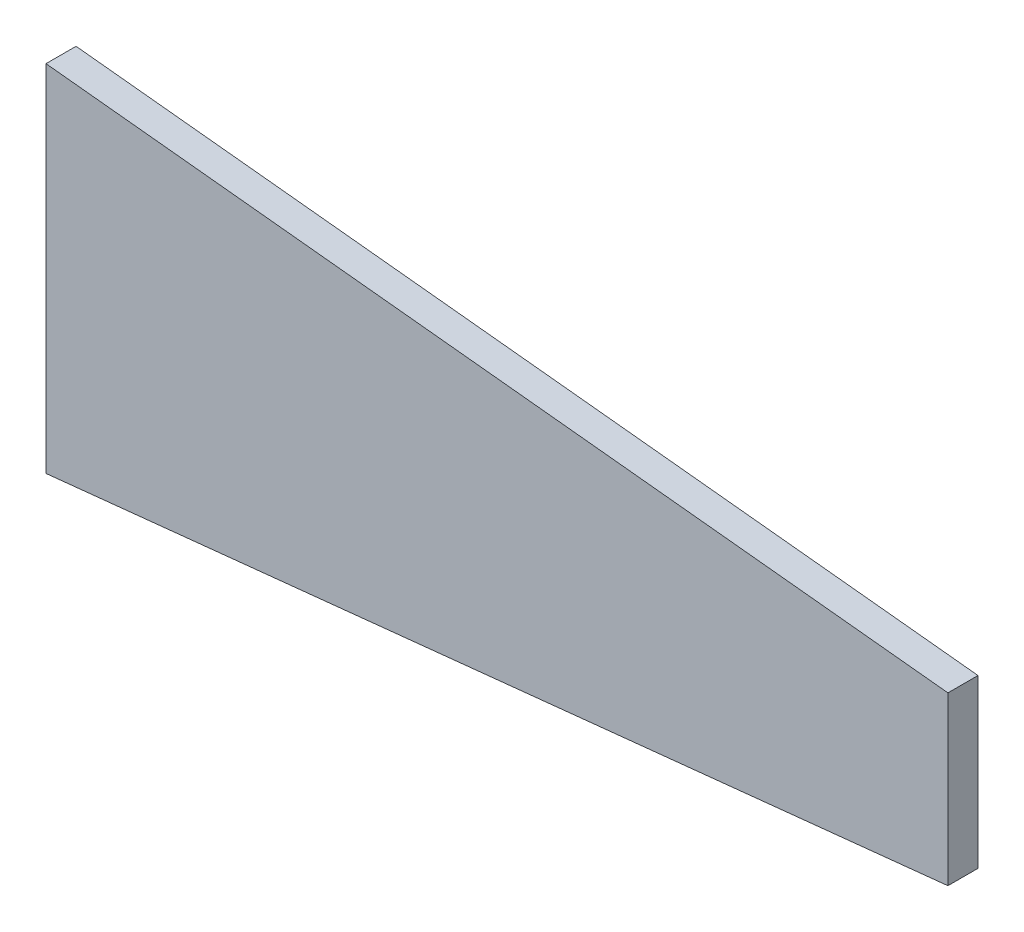
ISO-10303-21;
HEADER;
FILE_DESCRIPTION(('STEP AP214'),'2;1');
FILE_NAME('part.step','',(''),(''),'','','');
FILE_SCHEMA(('AUTOMOTIVE_DESIGN { 1 0 10303 214 1 1 1 1 }'));
ENDSEC;
DATA;
#1=APPLICATION_CONTEXT('core data for automotive mechanical design processes');
#2=APPLICATION_PROTOCOL_DEFINITION('international standard','automotive_design',2000,#1);
#3=PRODUCT_CONTEXT('',#1,'mechanical');
#4=PRODUCT('Part','Part','',(#3));
#5=PRODUCT_RELATED_PRODUCT_CATEGORY('part','',(#4));
#6=PRODUCT_DEFINITION_FORMATION('','',#4);
#7=PRODUCT_DEFINITION_CONTEXT('part definition',#1,'design');
#8=PRODUCT_DEFINITION('design','',#6,#7);
#9=PRODUCT_DEFINITION_SHAPE('','',#8);
#10=(LENGTH_UNIT() NAMED_UNIT(*) SI_UNIT(.MILLI.,.METRE.));
#11=(NAMED_UNIT(*) PLANE_ANGLE_UNIT() SI_UNIT($,.RADIAN.));
#12=(NAMED_UNIT(*) SI_UNIT($,.STERADIAN.) SOLID_ANGLE_UNIT());
#13=UNCERTAINTY_MEASURE_WITH_UNIT(LENGTH_MEASURE(1.E-05),#10,'distance_accuracy_value','');
#14=(GEOMETRIC_REPRESENTATION_CONTEXT(3) GLOBAL_UNCERTAINTY_ASSIGNED_CONTEXT((#13)) GLOBAL_UNIT_ASSIGNED_CONTEXT((#10,
#11,#12)) REPRESENTATION_CONTEXT('',''));
#15=CARTESIAN_POINT('',(0.,0.,0.));
#16=DIRECTION('',(0.,0.,1.));
#17=DIRECTION('',(1.,0.,0.));
#18=AXIS2_PLACEMENT_3D('',#15,#16,#17);
#19=CARTESIAN_POINT('',(180.,16.666666666667,2.273736754432E-13));
#20=DIRECTION('',(-0.103606084258982,-0.994618408890827,0.));
#21=DIRECTION('',(-0.994618408890827,0.103606084258982,0.));
#22=AXIS2_PLACEMENT_3D('',#19,#20,#21);
#23=PLANE('',#22);
#24=DIRECTION('',(0.,0.,1.));
#25=VECTOR('',#24,1.);
#26=CARTESIAN_POINT('',(0.,35.416666666663,-10917.5));
#27=LINE('',#26,#25);
#28=CARTESIAN_POINT('',(0.,35.416666666667,2.273736754432E-13));
#29=VERTEX_POINT('',#28);
#30=CARTESIAN_POINT('',(0.,35.416666666667,6.));
#31=VERTEX_POINT('',#30);
#32=EDGE_CURVE('E11',#29,#31,#27,.T.);
#33=ORIENTED_EDGE('',*,*,#32,.T.);
#34=DIRECTION('',(-0.994618408890827,0.103606084258982,0.));
#35=VECTOR('',#34,1.);
#36=CARTESIAN_POINT('',(180.,16.666666666667,6.));
#37=LINE('',#36,#35);
#38=CARTESIAN_POINT('',(180.,16.666666666667,6.));
#39=VERTEX_POINT('',#38);
#40=EDGE_CURVE('E25',#39,#31,#37,.T.);
#41=ORIENTED_EDGE('',*,*,#40,.F.);
#42=DIRECTION('',(0.,0.,1.));
#43=VECTOR('',#42,1.);
#44=CARTESIAN_POINT('',(180.,16.666666666667,2.273736754432E-13));
#45=LINE('',#44,#43);
#46=CARTESIAN_POINT('',(180.,16.666666666667,2.273736754432E-13));
#47=VERTEX_POINT('',#46);
#48=EDGE_CURVE('E101',#47,#39,#45,.T.);
#49=ORIENTED_EDGE('',*,*,#48,.F.);
#50=DIRECTION('',(-0.994618408890827,0.103606084258982,0.));
#51=VECTOR('',#50,1.);
#52=CARTESIAN_POINT('',(180.,16.666666666667,2.273736754432E-13));
#53=LINE('',#52,#51);
#54=EDGE_CURVE('E74',#47,#29,#53,.T.);
#55=ORIENTED_EDGE('',*,*,#54,.T.);
#56=EDGE_LOOP('',(#33,#41,#49,#55));
#57=FACE_BOUND('',#56,.T.);
#58=ADVANCED_FACE('F17',(#57),#23,.F.);
#59=CARTESIAN_POINT('',(0.,-18720.,-21835.));
#60=DIRECTION('',(1.,0.,0.));
#61=DIRECTION('',(0.,1.,0.));
#62=AXIS2_PLACEMENT_3D('',#59,#60,#61);
#63=PLANE('',#62);
#64=ORIENTED_EDGE('',*,*,#32,.F.);
#65=DIRECTION('',(0.,1.,0.));
#66=VECTOR('',#65,1.);
#67=CARTESIAN_POINT('',(0.,-9360.,1.136868377216E-12));
#68=LINE('',#67,#66);
#69=CARTESIAN_POINT('',(0.,-35.41666666666,2.273736754432E-13));
#70=VERTEX_POINT('',#69);
#71=EDGE_CURVE('E79',#70,#29,#68,.T.);
#72=ORIENTED_EDGE('',*,*,#71,.F.);
#73=DIRECTION('',(0.,0.,-1.));
#74=VECTOR('',#73,1.);
#75=CARTESIAN_POINT('',(0.,-35.41666666666,-10917.5));
#76=LINE('',#75,#74);
#77=CARTESIAN_POINT('',(0.,-35.41666666666,6.));
#78=VERTEX_POINT('',#77);
#79=EDGE_CURVE('E87',#78,#70,#76,.T.);
#80=ORIENTED_EDGE('',*,*,#79,.F.);
#81=DIRECTION('',(0.,1.,0.));
#82=VECTOR('',#81,1.);
#83=CARTESIAN_POINT('',(0.,-9360.,6.000000000001));
#84=LINE('',#83,#82);
#85=EDGE_CURVE('E111',#78,#31,#84,.T.);
#86=ORIENTED_EDGE('',*,*,#85,.T.);
#87=EDGE_LOOP('',(#64,#72,#80,#86));
#88=FACE_BOUND('',#87,.T.);
#89=ADVANCED_FACE('F119',(#88),#63,.F.);
#90=CARTESIAN_POINT('',(6.268384370371,2.273736754432E-13,6.));
#91=DIRECTION('',(0.,0.,1.));
#92=DIRECTION('',(0.,-1.,0.));
#93=AXIS2_PLACEMENT_3D('',#90,#91,#92);
#94=PLANE('',#93);
#95=ORIENTED_EDGE('',*,*,#85,.F.);
#96=DIRECTION('',(0.994618408890827,0.103606084258982,0.));
#97=VECTOR('',#96,1.);
#98=CARTESIAN_POINT('',(-140.,-50.,6.));
#99=LINE('',#98,#97);
#100=CARTESIAN_POINT('',(180.,-16.66666666666,6.));
#101=VERTEX_POINT('',#100);
#102=EDGE_CURVE('E94',#78,#101,#99,.T.);
#103=ORIENTED_EDGE('',*,*,#102,.T.);
#104=DIRECTION('',(0.,1.,0.));
#105=VECTOR('',#104,1.);
#106=CARTESIAN_POINT('',(180.,-16.66666666666,6.));
#107=LINE('',#106,#105);
#108=EDGE_CURVE('E91',#101,#39,#107,.T.);
#109=ORIENTED_EDGE('',*,*,#108,.T.);
#110=ORIENTED_EDGE('',*,*,#40,.T.);
#111=EDGE_LOOP('',(#95,#103,#109,#110));
#112=FACE_BOUND('',#111,.T.);
#113=ADVANCED_FACE('F117',(#112),#94,.T.);
#114=CARTESIAN_POINT('',(180.,-16.66666666666,2.273736754432E-13));
#115=DIRECTION('',(-1.,0.,0.));
#116=DIRECTION('',(0.,0.,1.));
#117=AXIS2_PLACEMENT_3D('',#114,#115,#116);
#118=PLANE('',#117);
#119=DIRECTION('',(0.,1.,0.));
#120=VECTOR('',#119,1.);
#121=CARTESIAN_POINT('',(180.,-16.66666666666,2.273736754432E-13));
#122=LINE('',#121,#120);
#123=CARTESIAN_POINT('',(180.,-16.66666666666,2.273736754432E-13));
#124=VERTEX_POINT('',#123);
#125=EDGE_CURVE('E68',#124,#47,#122,.T.);
#126=ORIENTED_EDGE('',*,*,#125,.T.);
#127=ORIENTED_EDGE('',*,*,#48,.T.);
#128=ORIENTED_EDGE('',*,*,#108,.F.);
#129=DIRECTION('',(0.,0.,1.));
#130=VECTOR('',#129,1.);
#131=CARTESIAN_POINT('',(180.,-16.66666666666,2.273736754432E-13));
#132=LINE('',#131,#130);
#133=EDGE_CURVE('E85',#124,#101,#132,.T.);
#134=ORIENTED_EDGE('',*,*,#133,.F.);
#135=EDGE_LOOP('',(#126,#127,#128,#134));
#136=FACE_BOUND('',#135,.T.);
#137=ADVANCED_FACE('F90',(#136),#118,.F.);
#138=CARTESIAN_POINT('',(6.268384370371,2.273736754432E-13,2.273736754432E-13));
#139=DIRECTION('',(0.,0.,1.));
#140=DIRECTION('',(0.,-1.,0.));
#141=AXIS2_PLACEMENT_3D('',#138,#139,#140);
#142=PLANE('',#141);
#143=ORIENTED_EDGE('',*,*,#54,.F.);
#144=ORIENTED_EDGE('',*,*,#125,.F.);
#145=DIRECTION('',(0.994618408890827,0.103606084258982,0.));
#146=VECTOR('',#145,1.);
#147=CARTESIAN_POINT('',(-140.,-50.,2.273736754432E-13));
#148=LINE('',#147,#146);
#149=EDGE_CURVE('E72',#70,#124,#148,.T.);
#150=ORIENTED_EDGE('',*,*,#149,.F.);
#151=ORIENTED_EDGE('',*,*,#71,.T.);
#152=EDGE_LOOP('',(#143,#144,#150,#151));
#153=FACE_BOUND('',#152,.T.);
#154=ADVANCED_FACE('F70',(#153),#142,.F.);
#155=CARTESIAN_POINT('',(-140.,-50.,2.273736754432E-13));
#156=DIRECTION('',(-0.103606084258982,0.994618408890827,0.));
#157=DIRECTION('',(0.,0.,1.));
#158=AXIS2_PLACEMENT_3D('',#155,#156,#157);
#159=PLANE('',#158);
#160=ORIENTED_EDGE('',*,*,#133,.T.);
#161=ORIENTED_EDGE('',*,*,#102,.F.);
#162=ORIENTED_EDGE('',*,*,#79,.T.);
#163=ORIENTED_EDGE('',*,*,#149,.T.);
#164=EDGE_LOOP('',(#160,#161,#162,#163));
#165=FACE_BOUND('',#164,.T.);
#166=ADVANCED_FACE('F83',(#165),#159,.F.);
#167=CLOSED_SHELL('',(#58,#89,#113,#137,#154,#166));
#168=MANIFOLD_SOLID_BREP('B1',#167);
#169=ADVANCED_BREP_SHAPE_REPRESENTATION('',(#18,#168),#14);
#170=SHAPE_DEFINITION_REPRESENTATION(#9,#169);
ENDSEC;
END-ISO-10303-21;
